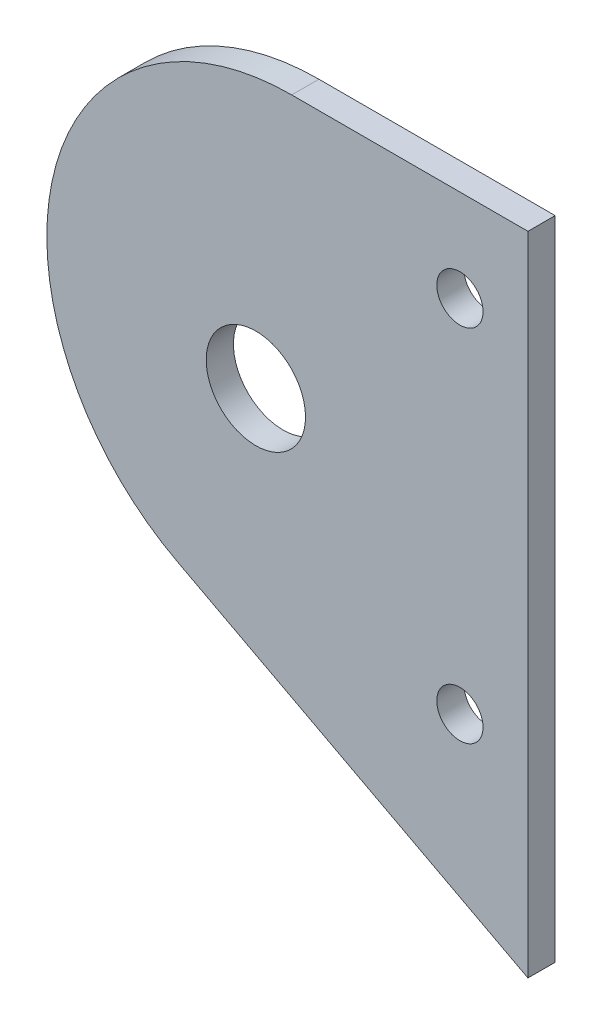
ISO-10303-21;
HEADER;
FILE_DESCRIPTION(('STEP AP214'),'2;1');
FILE_NAME('part.step','',(''),(''),'','','');
FILE_SCHEMA(('AUTOMOTIVE_DESIGN { 1 0 10303 214 1 1 1 1 }'));
ENDSEC;
DATA;
#1=APPLICATION_CONTEXT('core data for automotive mechanical design processes');
#2=APPLICATION_PROTOCOL_DEFINITION('international standard','automotive_design',2000,#1);
#3=PRODUCT_CONTEXT('',#1,'mechanical');
#4=PRODUCT('Part','Part','',(#3));
#5=PRODUCT_RELATED_PRODUCT_CATEGORY('part','',(#4));
#6=PRODUCT_DEFINITION_FORMATION('','',#4);
#7=PRODUCT_DEFINITION_CONTEXT('part definition',#1,'design');
#8=PRODUCT_DEFINITION('design','',#6,#7);
#9=PRODUCT_DEFINITION_SHAPE('','',#8);
#10=(LENGTH_UNIT() NAMED_UNIT(*) SI_UNIT(.MILLI.,.METRE.));
#11=(NAMED_UNIT(*) PLANE_ANGLE_UNIT() SI_UNIT($,.RADIAN.));
#12=(NAMED_UNIT(*) SI_UNIT($,.STERADIAN.) SOLID_ANGLE_UNIT());
#13=UNCERTAINTY_MEASURE_WITH_UNIT(LENGTH_MEASURE(1.E-05),#10,'distance_accuracy_value','');
#14=(GEOMETRIC_REPRESENTATION_CONTEXT(3) GLOBAL_UNCERTAINTY_ASSIGNED_CONTEXT((#13)) GLOBAL_UNIT_ASSIGNED_CONTEXT((#10,
#11,#12)) REPRESENTATION_CONTEXT('',''));
#15=CARTESIAN_POINT('',(0.,0.,0.));
#16=DIRECTION('',(0.,0.,1.));
#17=DIRECTION('',(1.,0.,0.));
#18=AXIS2_PLACEMENT_3D('',#15,#16,#17);
#19=CARTESIAN_POINT('',(0.,0.,2.));
#20=DIRECTION('',(0.,0.,-1.));
#21=DIRECTION('',(-1.,0.,0.));
#22=AXIS2_PLACEMENT_3D('',#19,#20,#21);
#23=PLANE('',#22);
#24=CARTESIAN_POINT('',(-160.,33.228756555323,2.));
#25=DIRECTION('',(0.,0.,-1.));
#26=DIRECTION('',(-1.,0.,0.));
#27=AXIS2_PLACEMENT_3D('',#24,#25,#26);
#28=CIRCLE('',#27,1.70000000000001);
#29=CARTESIAN_POINT('',(-161.7,33.228756555323,2.));
#30=VERTEX_POINT('',#29);
#31=EDGE_CURVE('E196',#30,#30,#28,.T.);
#32=ORIENTED_EDGE('',*,*,#31,.T.);
#33=EDGE_LOOP('',(#32));
#34=FACE_BOUND('',#33,.T.);
#35=CARTESIAN_POINT('',(-160.,6.771243444677,2.));
#36=DIRECTION('',(0.,0.,-1.));
#37=DIRECTION('',(-1.,0.,0.));
#38=AXIS2_PLACEMENT_3D('',#35,#36,#37);
#39=CIRCLE('',#38,1.70000000000001);
#40=CARTESIAN_POINT('',(-161.7,6.771243444677,2.));
#41=VERTEX_POINT('',#40);
#42=EDGE_CURVE('E82',#41,#41,#39,.T.);
#43=ORIENTED_EDGE('',*,*,#42,.T.);
#44=EDGE_LOOP('',(#43));
#45=FACE_BOUND('',#44,.T.);
#46=CARTESIAN_POINT('',(-175.,20.,2.));
#47=DIRECTION('',(0.,0.,1.));
#48=DIRECTION('',(1.,0.,0.));
#49=AXIS2_PLACEMENT_3D('',#46,#47,#48);
#50=CIRCLE('',#49,3.64999999999998);
#51=CARTESIAN_POINT('',(-171.35,20.,2.));
#52=VERTEX_POINT('',#51);
#53=EDGE_CURVE('E97',#52,#52,#50,.T.);
#54=ORIENTED_EDGE('',*,*,#53,.F.);
#55=EDGE_LOOP('',(#54));
#56=FACE_BOUND('',#55,.T.);
#57=DIRECTION('',(0.,-1.,0.));
#58=VECTOR('',#57,1.);
#59=CARTESIAN_POINT('',(-155.,61.1481671859586,2.));
#60=LINE('',#59,#58);
#61=CARTESIAN_POINT('',(-155.,40.,2.));
#62=VERTEX_POINT('',#61);
#63=CARTESIAN_POINT('',(-155.,-7.53286063721654,2.));
#64=VERTEX_POINT('',#63);
#65=EDGE_CURVE('E74',#62,#64,#60,.T.);
#66=ORIENTED_EDGE('',*,*,#65,.F.);
#67=DIRECTION('',(-1.,0.,0.));
#68=VECTOR('',#67,1.);
#69=CARTESIAN_POINT('',(110.,40.,2.));
#70=LINE('',#69,#68);
#71=CARTESIAN_POINT('',(-172.363587037174,40.,2.));
#72=VERTEX_POINT('',#71);
#73=EDGE_CURVE('E79',#62,#72,#70,.T.);
#74=ORIENTED_EDGE('',*,*,#73,.T.);
#75=CARTESIAN_POINT('',(-172.363587037174,22.,2.));
#76=DIRECTION('',(0.,0.,-1.));
#77=DIRECTION('',(-1.,0.,0.));
#78=AXIS2_PLACEMENT_3D('',#75,#76,#77);
#79=CIRCLE('',#78,18.);
#80=CARTESIAN_POINT('',(-180.772782979186,6.08505659423045,2.));
#81=VERTEX_POINT('',#80);
#82=EDGE_CURVE('E56',#72,#81,#79,.F.);
#83=ORIENTED_EDGE('',*,*,#82,.T.);
#84=DIRECTION('',(0.884163522542753,-0.467177552334003,0.));
#85=VECTOR('',#84,1.);
#86=CARTESIAN_POINT('',(-244.958991581617,40.,2.));
#87=LINE('',#86,#85);
#88=EDGE_CURVE('E81',#81,#64,#87,.T.);
#89=ORIENTED_EDGE('',*,*,#88,.T.);
#90=EDGE_LOOP('',(#66,#74,#83,#89));
#91=FACE_BOUND('',#90,.T.);
#92=ADVANCED_FACE('F34',(#34,#45,#56,#91),#23,.F.);
#93=CARTESIAN_POINT('',(0.,0.,0.));
#94=DIRECTION('',(0.,0.,-1.));
#95=DIRECTION('',(-1.,0.,0.));
#96=AXIS2_PLACEMENT_3D('',#93,#94,#95);
#97=PLANE('',#96);
#98=CARTESIAN_POINT('',(-160.,33.228756555323,0.));
#99=DIRECTION('',(0.,0.,-1.));
#100=DIRECTION('',(-1.,0.,0.));
#101=AXIS2_PLACEMENT_3D('',#98,#99,#100);
#102=CIRCLE('',#101,1.69999999999998);
#103=CARTESIAN_POINT('',(-161.7,33.228756555323,0.));
#104=VERTEX_POINT('',#103);
#105=EDGE_CURVE('E199',#104,#104,#102,.T.);
#106=ORIENTED_EDGE('',*,*,#105,.F.);
#107=EDGE_LOOP('',(#106));
#108=FACE_BOUND('',#107,.T.);
#109=CARTESIAN_POINT('',(-160.,6.771243444677,0.));
#110=DIRECTION('',(0.,0.,-1.));
#111=DIRECTION('',(-1.,0.,0.));
#112=AXIS2_PLACEMENT_3D('',#109,#110,#111);
#113=CIRCLE('',#112,1.69999999999998);
#114=CARTESIAN_POINT('',(-161.7,6.771243444677,0.));
#115=VERTEX_POINT('',#114);
#116=EDGE_CURVE('E201',#115,#115,#113,.T.);
#117=ORIENTED_EDGE('',*,*,#116,.F.);
#118=EDGE_LOOP('',(#117));
#119=FACE_BOUND('',#118,.T.);
#120=CARTESIAN_POINT('',(-175.,20.,0.));
#121=DIRECTION('',(0.,0.,1.));
#122=DIRECTION('',(1.,0.,0.));
#123=AXIS2_PLACEMENT_3D('',#120,#121,#122);
#124=CIRCLE('',#123,3.64999999999998);
#125=CARTESIAN_POINT('',(-171.35,20.,0.));
#126=VERTEX_POINT('',#125);
#127=EDGE_CURVE('E111',#126,#126,#124,.T.);
#128=ORIENTED_EDGE('',*,*,#127,.T.);
#129=EDGE_LOOP('',(#128));
#130=FACE_BOUND('',#129,.T.);
#131=DIRECTION('',(-1.,0.,0.));
#132=VECTOR('',#131,1.);
#133=CARTESIAN_POINT('',(-244.958991581617,40.,0.));
#134=LINE('',#133,#132);
#135=CARTESIAN_POINT('',(-155.,40.,0.));
#136=VERTEX_POINT('',#135);
#137=CARTESIAN_POINT('',(-172.363587037174,40.,0.));
#138=VERTEX_POINT('',#137);
#139=EDGE_CURVE('E90',#136,#138,#134,.T.);
#140=ORIENTED_EDGE('',*,*,#139,.F.);
#141=DIRECTION('',(0.,-1.,0.));
#142=VECTOR('',#141,1.);
#143=CARTESIAN_POINT('',(-155.,0.,0.));
#144=LINE('',#143,#142);
#145=CARTESIAN_POINT('',(-155.,-7.53286063721655,0.));
#146=VERTEX_POINT('',#145);
#147=EDGE_CURVE('E48',#136,#146,#144,.T.);
#148=ORIENTED_EDGE('',*,*,#147,.T.);
#149=DIRECTION('',(0.884163522542753,-0.467177552334003,0.));
#150=VECTOR('',#149,1.);
#151=CARTESIAN_POINT('',(-244.958991581617,40.,0.));
#152=LINE('',#151,#150);
#153=CARTESIAN_POINT('',(-180.772782979186,6.08505659423045,0.));
#154=VERTEX_POINT('',#153);
#155=EDGE_CURVE('E94',#154,#146,#152,.T.);
#156=ORIENTED_EDGE('',*,*,#155,.F.);
#157=CARTESIAN_POINT('',(-172.363587037174,22.,0.));
#158=DIRECTION('',(0.,0.,-1.));
#159=DIRECTION('',(-1.,0.,0.));
#160=AXIS2_PLACEMENT_3D('',#157,#158,#159);
#161=CIRCLE('',#160,18.);
#162=EDGE_CURVE('E88',#154,#138,#161,.T.);
#163=ORIENTED_EDGE('',*,*,#162,.T.);
#164=EDGE_LOOP('',(#140,#148,#156,#163));
#165=FACE_BOUND('',#164,.T.);
#166=ADVANCED_FACE('F108',(#108,#119,#130,#165),#97,.T.);
#167=CARTESIAN_POINT('',(-244.958991581617,40.,2.));
#168=DIRECTION('',(0.467177552334003,0.884163522542753,0.));
#169=DIRECTION('',(-0.884163522542753,0.467177552334003,0.));
#170=AXIS2_PLACEMENT_3D('',#167,#168,#169);
#171=PLANE('',#170);
#172=DIRECTION('',(0.,0.,-1.));
#173=VECTOR('',#172,1.);
#174=CARTESIAN_POINT('',(-155.,-7.53286063721654,2.));
#175=LINE('',#174,#173);
#176=EDGE_CURVE('E109',#64,#146,#175,.T.);
#177=ORIENTED_EDGE('',*,*,#176,.F.);
#178=ORIENTED_EDGE('',*,*,#88,.F.);
#179=DIRECTION('',(0.,0.,-1.));
#180=VECTOR('',#179,1.);
#181=CARTESIAN_POINT('',(-180.772782979186,6.08505659423045,2.));
#182=LINE('',#181,#180);
#183=EDGE_CURVE('E42',#81,#154,#182,.T.);
#184=ORIENTED_EDGE('',*,*,#183,.T.);
#185=ORIENTED_EDGE('',*,*,#155,.T.);
#186=EDGE_LOOP('',(#177,#178,#184,#185));
#187=FACE_BOUND('',#186,.T.);
#188=ADVANCED_FACE('F105',(#187),#171,.F.);
#189=CARTESIAN_POINT('',(-244.958991581617,40.,2.));
#190=DIRECTION('',(0.,-1.,0.));
#191=DIRECTION('',(0.,0.,-1.));
#192=AXIS2_PLACEMENT_3D('',#189,#190,#191);
#193=PLANE('',#192);
#194=DIRECTION('',(0.,0.,1.));
#195=VECTOR('',#194,1.);
#196=CARTESIAN_POINT('',(-155.,40.,2.));
#197=LINE('',#196,#195);
#198=EDGE_CURVE('E11',#136,#62,#197,.T.);
#199=ORIENTED_EDGE('',*,*,#198,.F.);
#200=ORIENTED_EDGE('',*,*,#139,.T.);
#201=DIRECTION('',(0.,0.,-1.));
#202=VECTOR('',#201,1.);
#203=CARTESIAN_POINT('',(-172.363587037174,40.,2.));
#204=LINE('',#203,#202);
#205=EDGE_CURVE('E86',#138,#72,#204,.F.);
#206=ORIENTED_EDGE('',*,*,#205,.T.);
#207=ORIENTED_EDGE('',*,*,#73,.F.);
#208=EDGE_LOOP('',(#199,#200,#206,#207));
#209=FACE_BOUND('',#208,.T.);
#210=ADVANCED_FACE('F84',(#209),#193,.F.);
#211=CARTESIAN_POINT('',(-175.,20.,2.));
#212=DIRECTION('',(0.,0.,-1.));
#213=DIRECTION('',(-1.,0.,0.));
#214=AXIS2_PLACEMENT_3D('',#211,#212,#213);
#215=CYLINDRICAL_SURFACE('',#214,3.64999999999998);
#216=ORIENTED_EDGE('',*,*,#53,.T.);
#217=EDGE_LOOP('',(#216));
#218=FACE_BOUND('',#217,.T.);
#219=ORIENTED_EDGE('',*,*,#127,.F.);
#220=EDGE_LOOP('',(#219));
#221=FACE_BOUND('',#220,.T.);
#222=ADVANCED_FACE('F120',(#218,#221),#215,.F.);
#223=CARTESIAN_POINT('',(-172.363587037174,22.,2.));
#224=DIRECTION('',(0.,0.,-1.));
#225=DIRECTION('',(-1.,0.,0.));
#226=AXIS2_PLACEMENT_3D('',#223,#224,#225);
#227=CYLINDRICAL_SURFACE('',#226,18.);
#228=ORIENTED_EDGE('',*,*,#82,.F.);
#229=ORIENTED_EDGE('',*,*,#205,.F.);
#230=ORIENTED_EDGE('',*,*,#162,.F.);
#231=ORIENTED_EDGE('',*,*,#183,.F.);
#232=EDGE_LOOP('',(#228,#229,#230,#231));
#233=FACE_BOUND('',#232,.T.);
#234=ADVANCED_FACE('F36',(#233),#227,.T.);
#235=CARTESIAN_POINT('',(-155.,61.1481671859586,2.));
#236=DIRECTION('',(1.,0.,0.));
#237=DIRECTION('',(0.,1.,0.));
#238=AXIS2_PLACEMENT_3D('',#235,#236,#237);
#239=PLANE('',#238);
#240=ORIENTED_EDGE('',*,*,#176,.T.);
#241=ORIENTED_EDGE('',*,*,#147,.F.);
#242=ORIENTED_EDGE('',*,*,#198,.T.);
#243=ORIENTED_EDGE('',*,*,#65,.T.);
#244=EDGE_LOOP('',(#240,#241,#242,#243));
#245=FACE_BOUND('',#244,.T.);
#246=ADVANCED_FACE('F73',(#245),#239,.T.);
#247=CARTESIAN_POINT('',(-160.,6.771243444677,0.));
#248=DIRECTION('',(0.,0.,-1.));
#249=DIRECTION('',(-1.,0.,0.));
#250=AXIS2_PLACEMENT_3D('',#247,#248,#249);
#251=CYLINDRICAL_SURFACE('',#250,1.69999999999999);
#252=ORIENTED_EDGE('',*,*,#42,.F.);
#253=EDGE_LOOP('',(#252));
#254=FACE_BOUND('',#253,.T.);
#255=ORIENTED_EDGE('',*,*,#116,.T.);
#256=EDGE_LOOP('',(#255));
#257=FACE_BOUND('',#256,.T.);
#258=ADVANCED_FACE('F161',(#254,#257),#251,.F.);
#259=CARTESIAN_POINT('',(-160.,33.228756555323,0.));
#260=DIRECTION('',(0.,0.,-1.));
#261=DIRECTION('',(-1.,0.,0.));
#262=AXIS2_PLACEMENT_3D('',#259,#260,#261);
#263=CYLINDRICAL_SURFACE('',#262,1.69999999999999);
#264=ORIENTED_EDGE('',*,*,#31,.F.);
#265=EDGE_LOOP('',(#264));
#266=FACE_BOUND('',#265,.T.);
#267=ORIENTED_EDGE('',*,*,#105,.T.);
#268=EDGE_LOOP('',(#267));
#269=FACE_BOUND('',#268,.T.);
#270=ADVANCED_FACE('F180',(#266,#269),#263,.F.);
#271=CLOSED_SHELL('',(#92,#166,#188,#210,#222,#234,#246,#258,#270));
#272=MANIFOLD_SOLID_BREP('B2',#271);
#273=ADVANCED_BREP_SHAPE_REPRESENTATION('',(#18,#272),#14);
#274=SHAPE_DEFINITION_REPRESENTATION(#9,#273);
ENDSEC;
END-ISO-10303-21;
